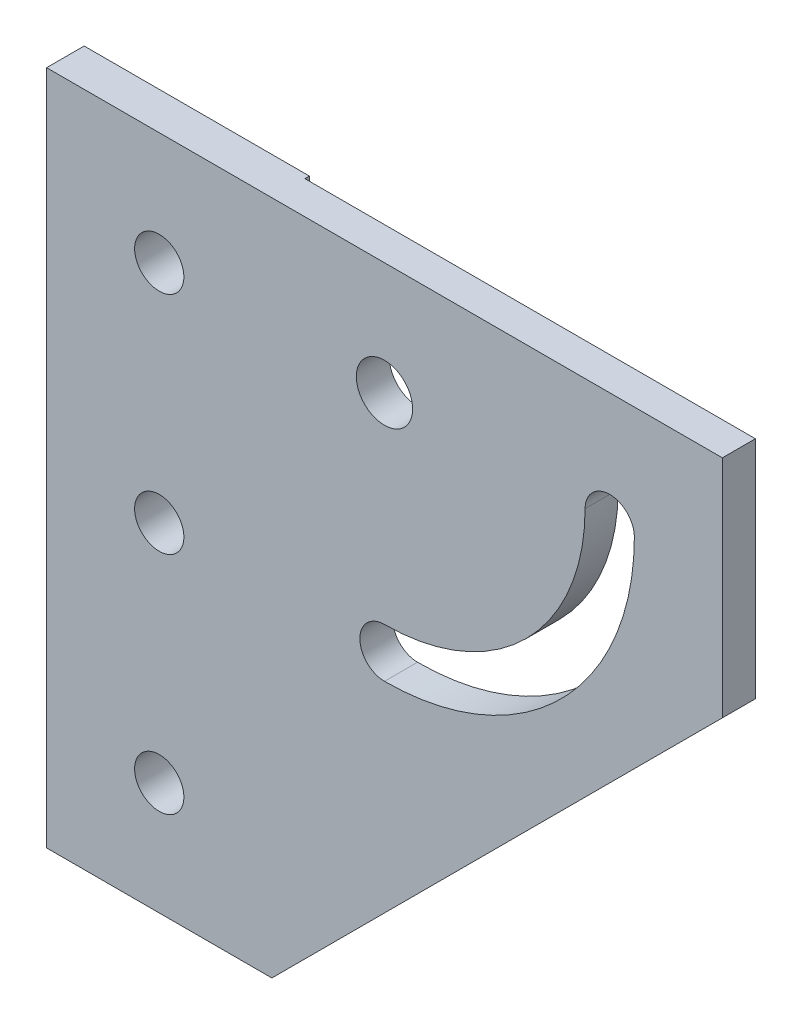
ISO-10303-21;
HEADER;
FILE_DESCRIPTION(('STEP AP214'),'2;1');
FILE_NAME('part.step','',(''),(''),'','','');
FILE_SCHEMA(('AUTOMOTIVE_DESIGN { 1 0 10303 214 1 1 1 1 }'));
ENDSEC;
DATA;
#1=APPLICATION_CONTEXT('core data for automotive mechanical design processes');
#2=APPLICATION_PROTOCOL_DEFINITION('international standard','automotive_design',2000,#1);
#3=PRODUCT_CONTEXT('',#1,'mechanical');
#4=PRODUCT('Part','Part','',(#3));
#5=PRODUCT_RELATED_PRODUCT_CATEGORY('part','',(#4));
#6=PRODUCT_DEFINITION_FORMATION('','',#4);
#7=PRODUCT_DEFINITION_CONTEXT('part definition',#1,'design');
#8=PRODUCT_DEFINITION('design','',#6,#7);
#9=PRODUCT_DEFINITION_SHAPE('','',#8);
#10=(LENGTH_UNIT() NAMED_UNIT(*) SI_UNIT(.MILLI.,.METRE.));
#11=(NAMED_UNIT(*) PLANE_ANGLE_UNIT() SI_UNIT($,.RADIAN.));
#12=(NAMED_UNIT(*) SI_UNIT($,.STERADIAN.) SOLID_ANGLE_UNIT());
#13=UNCERTAINTY_MEASURE_WITH_UNIT(LENGTH_MEASURE(1.E-05),#10,'distance_accuracy_value','');
#14=(GEOMETRIC_REPRESENTATION_CONTEXT(3) GLOBAL_UNCERTAINTY_ASSIGNED_CONTEXT((#13)) GLOBAL_UNIT_ASSIGNED_CONTEXT((#10,
#11,#12)) REPRESENTATION_CONTEXT('',''));
#15=CARTESIAN_POINT('',(0.,0.,0.));
#16=DIRECTION('',(0.,0.,1.));
#17=DIRECTION('',(1.,0.,0.));
#18=AXIS2_PLACEMENT_3D('',#15,#16,#17);
#19=CARTESIAN_POINT('',(-49.0731819323499,55.0077799028016,-5.98163409796489));
#20=DIRECTION('',(0.,0.,1.));
#21=DIRECTION('',(1.,0.,0.));
#22=AXIS2_PLACEMENT_3D('',#19,#20,#21);
#23=PLANE('',#22);
#24=CARTESIAN_POINT('',(-30.02318193235,-40.2422200971983,-5.98163409796489));
#25=DIRECTION('',(0.,0.,-1.));
#26=DIRECTION('',(-1.,0.,0.));
#27=AXIS2_PLACEMENT_3D('',#24,#25,#26);
#28=CIRCLE('',#27,4.16560000000001);
#29=CARTESIAN_POINT('',(-34.18878193235,-40.2422200971983,-5.98163409796489));
#30=VERTEX_POINT('',#29);
#31=EDGE_CURVE('E385',#30,#30,#28,.T.);
#32=ORIENTED_EDGE('',*,*,#31,.F.);
#33=EDGE_LOOP('',(#32));
#34=FACE_BOUND('',#33,.T.);
#35=CARTESIAN_POINT('',(-30.02318193235,35.9577799028017,-5.98163409796489));
#36=DIRECTION('',(0.,0.,-1.));
#37=DIRECTION('',(-1.,0.,0.));
#38=AXIS2_PLACEMENT_3D('',#35,#36,#37);
#39=CIRCLE('',#38,4.16560000000001);
#40=CARTESIAN_POINT('',(-34.18878193235,35.9577799028017,-5.98163409796489));
#41=VERTEX_POINT('',#40);
#42=EDGE_CURVE('E393',#41,#41,#39,.T.);
#43=ORIENTED_EDGE('',*,*,#42,.F.);
#44=EDGE_LOOP('',(#43));
#45=FACE_BOUND('',#44,.T.);
#46=DIRECTION('',(1.,0.,0.));
#47=VECTOR('',#46,1.);
#48=CARTESIAN_POINT('',(-10.97318193235,55.0077799028016,-5.98163409796489));
#49=LINE('',#48,#47);
#50=CARTESIAN_POINT('',(-49.0731819323499,55.0077799028016,-5.98163409796489));
#51=VERTEX_POINT('',#50);
#52=CARTESIAN_POINT('',(-10.97318193235,55.0077799028016,-5.98163409796489));
#53=VERTEX_POINT('',#52);
#54=EDGE_CURVE('E155',#51,#53,#49,.T.);
#55=ORIENTED_EDGE('',*,*,#54,.T.);
#56=DIRECTION('',(0.,-1.,0.));
#57=VECTOR('',#56,1.);
#58=CARTESIAN_POINT('',(-10.97318193235,-59.2922200971983,-5.98163409796489));
#59=LINE('',#58,#57);
#60=CARTESIAN_POINT('',(-10.97318193235,-59.2922200971983,-5.98163409796489));
#61=VERTEX_POINT('',#60);
#62=EDGE_CURVE('E158',#53,#61,#59,.T.);
#63=ORIENTED_EDGE('',*,*,#62,.T.);
#64=DIRECTION('',(-1.,0.,0.));
#65=VECTOR('',#64,1.);
#66=CARTESIAN_POINT('',(-49.0731819323499,-59.2922200971983,-5.98163409796489));
#67=LINE('',#66,#65);
#68=CARTESIAN_POINT('',(-49.0731819323499,-59.2922200971983,-5.98163409796489));
#69=VERTEX_POINT('',#68);
#70=EDGE_CURVE('E160',#61,#69,#67,.T.);
#71=ORIENTED_EDGE('',*,*,#70,.T.);
#72=DIRECTION('',(0.,1.,0.));
#73=VECTOR('',#72,1.);
#74=CARTESIAN_POINT('',(-49.0731819323499,55.0077799028016,-5.98163409796489));
#75=LINE('',#74,#73);
#76=EDGE_CURVE('E163',#69,#51,#75,.T.);
#77=ORIENTED_EDGE('',*,*,#76,.T.);
#78=EDGE_LOOP('',(#55,#63,#71,#77));
#79=FACE_BOUND('',#78,.T.);
#80=CARTESIAN_POINT('',(-30.02318193235,-2.14222009719833,-5.98163409796489));
#81=DIRECTION('',(0.,0.,-1.));
#82=DIRECTION('',(-1.,0.,0.));
#83=AXIS2_PLACEMENT_3D('',#80,#81,#82);
#84=CIRCLE('',#83,4.16560000000001);
#85=CARTESIAN_POINT('',(-34.18878193235,-2.14222009719833,-5.98163409796489));
#86=VERTEX_POINT('',#85);
#87=EDGE_CURVE('E398',#86,#86,#84,.T.);
#88=ORIENTED_EDGE('',*,*,#87,.F.);
#89=EDGE_LOOP('',(#88));
#90=FACE_BOUND('',#89,.T.);
#91=ADVANCED_FACE('F34',(#34,#45,#79,#90),#23,.F.);
#92=CARTESIAN_POINT('',(65.22681806765,55.0077799028016,-5.21963409796489));
#93=DIRECTION('',(0.,0.,1.));
#94=DIRECTION('',(1.,0.,0.));
#95=AXIS2_PLACEMENT_3D('',#92,#93,#94);
#96=PLANE('',#95);
#97=CARTESIAN_POINT('',(8.07681806765004,35.9577799028017,-5.21963409796489));
#98=DIRECTION('',(0.,0.,1.));
#99=DIRECTION('',(1.,0.,0.));
#100=AXIS2_PLACEMENT_3D('',#97,#98,#99);
#101=CIRCLE('',#100,4.76249999999999);
#102=CARTESIAN_POINT('',(12.83931806765,35.9577799028017,-5.21963409796489));
#103=VERTEX_POINT('',#102);
#104=EDGE_CURVE('E38',#103,#103,#101,.T.);
#105=ORIENTED_EDGE('',*,*,#104,.T.);
#106=EDGE_LOOP('',(#105));
#107=FACE_BOUND('',#106,.T.);
#108=CARTESIAN_POINT('',(46.17681806765,35.9577799028017,-5.21963409796489));
#109=DIRECTION('',(0.,0.,-1.));
#110=DIRECTION('',(-1.,0.,0.));
#111=AXIS2_PLACEMENT_3D('',#108,#109,#110);
#112=CIRCLE('',#111,4.16560000000002);
#113=CARTESIAN_POINT('',(42.01121806765,35.9577799028017,-5.21963409796489));
#114=VERTEX_POINT('',#113);
#115=CARTESIAN_POINT('',(50.34241806765,35.9577799028017,-5.21963409796489));
#116=VERTEX_POINT('',#115);
#117=EDGE_CURVE('E145',#114,#116,#112,.T.);
#118=ORIENTED_EDGE('',*,*,#117,.F.);
#119=CARTESIAN_POINT('',(8.07681806765004,35.9577799028017,-5.21963409796489));
#120=DIRECTION('',(0.,0.,1.));
#121=DIRECTION('',(1.,0.,0.));
#122=AXIS2_PLACEMENT_3D('',#119,#120,#121);
#123=CIRCLE('',#122,33.9344);
#124=CARTESIAN_POINT('',(8.07681806765004,2.02337990280166,-5.21963409796489));
#125=VERTEX_POINT('',#124);
#126=EDGE_CURVE('E51',#125,#114,#123,.T.);
#127=ORIENTED_EDGE('',*,*,#126,.F.);
#128=CARTESIAN_POINT('',(8.07681806765004,-2.14222009719833,-5.21963409796489));
#129=DIRECTION('',(0.,0.,-1.));
#130=DIRECTION('',(-1.,0.,0.));
#131=AXIS2_PLACEMENT_3D('',#128,#129,#130);
#132=CIRCLE('',#131,4.16559999999999);
#133=CARTESIAN_POINT('',(8.07681806765004,-6.30782009719834,-5.21963409796489));
#134=VERTEX_POINT('',#133);
#135=EDGE_CURVE('E133',#134,#125,#132,.T.);
#136=ORIENTED_EDGE('',*,*,#135,.F.);
#137=CARTESIAN_POINT('',(8.07681806765004,35.9577799028017,-5.21963409796489));
#138=DIRECTION('',(0.,0.,-1.));
#139=DIRECTION('',(-1.,0.,0.));
#140=AXIS2_PLACEMENT_3D('',#137,#138,#139);
#141=CIRCLE('',#140,42.2656);
#142=EDGE_CURVE('E136',#116,#134,#141,.T.);
#143=ORIENTED_EDGE('',*,*,#142,.F.);
#144=EDGE_LOOP('',(#118,#127,#136,#143));
#145=FACE_BOUND('',#144,.T.);
#146=DIRECTION('',(0.,-1.,0.));
#147=VECTOR('',#146,1.);
#148=CARTESIAN_POINT('',(-10.97318193235,-59.2922200971983,-5.21963409796489));
#149=LINE('',#148,#147);
#150=CARTESIAN_POINT('',(-10.97318193235,55.0077799028016,-5.21963409796489));
#151=VERTEX_POINT('',#150);
#152=CARTESIAN_POINT('',(-10.97318193235,-59.2922200971983,-5.21963409796489));
#153=VERTEX_POINT('',#152);
#154=EDGE_CURVE('E151',#151,#153,#149,.T.);
#155=ORIENTED_EDGE('',*,*,#154,.F.);
#156=DIRECTION('',(-1.,0.,0.));
#157=VECTOR('',#156,1.);
#158=CARTESIAN_POINT('',(65.22681806765,55.0077799028016,-5.21963409796489));
#159=LINE('',#158,#157);
#160=CARTESIAN_POINT('',(65.22681806765,55.0077799028016,-5.21963409796489));
#161=VERTEX_POINT('',#160);
#162=EDGE_CURVE('E174',#161,#151,#159,.T.);
#163=ORIENTED_EDGE('',*,*,#162,.F.);
#164=DIRECTION('',(0.,1.,0.));
#165=VECTOR('',#164,1.);
#166=CARTESIAN_POINT('',(65.22681806765,16.9077799028017,-5.21963409796489));
#167=LINE('',#166,#165);
#168=CARTESIAN_POINT('',(65.22681806765,16.9077799028017,-5.21963409796489));
#169=VERTEX_POINT('',#168);
#170=EDGE_CURVE('E171',#169,#161,#167,.T.);
#171=ORIENTED_EDGE('',*,*,#170,.F.);
#172=DIRECTION('',(0.707106781186548,0.707106781186548,0.));
#173=VECTOR('',#172,1.);
#174=CARTESIAN_POINT('',(-10.97318193235,-59.2922200971983,-5.21963409796489));
#175=LINE('',#174,#173);
#176=EDGE_CURVE('E178',#153,#169,#175,.T.);
#177=ORIENTED_EDGE('',*,*,#176,.F.);
#178=EDGE_LOOP('',(#155,#163,#171,#177));
#179=FACE_BOUND('',#178,.T.);
#180=ADVANCED_FACE('F225',(#107,#145,#179),#96,.F.);
#181=CARTESIAN_POINT('',(65.22681806765,16.9077799028017,-5.21963409796489));
#182=DIRECTION('',(1.,0.,0.));
#183=DIRECTION('',(0.,0.,-1.));
#184=AXIS2_PLACEMENT_3D('',#181,#182,#183);
#185=PLANE('',#184);
#186=DIRECTION('',(0.,1.,0.));
#187=VECTOR('',#186,1.);
#188=CARTESIAN_POINT('',(65.22681806765,16.9077799028017,0.368365902035111));
#189=LINE('',#188,#187);
#190=CARTESIAN_POINT('',(65.22681806765,16.9077799028017,0.368365902035111));
#191=VERTEX_POINT('',#190);
#192=CARTESIAN_POINT('',(65.22681806765,55.0077799028016,0.368365902035111));
#193=VERTEX_POINT('',#192);
#194=EDGE_CURVE('E191',#191,#193,#189,.T.);
#195=ORIENTED_EDGE('',*,*,#194,.F.);
#196=DIRECTION('',(0.,0.,1.));
#197=VECTOR('',#196,1.);
#198=CARTESIAN_POINT('',(65.22681806765,16.9077799028017,-5.21963409796489));
#199=LINE('',#198,#197);
#200=EDGE_CURVE('E11',#169,#191,#199,.T.);
#201=ORIENTED_EDGE('',*,*,#200,.F.);
#202=ORIENTED_EDGE('',*,*,#170,.T.);
#203=DIRECTION('',(0.,0.,1.));
#204=VECTOR('',#203,1.);
#205=CARTESIAN_POINT('',(65.22681806765,55.0077799028016,-5.21963409796489));
#206=LINE('',#205,#204);
#207=EDGE_CURVE('E184',#161,#193,#206,.T.);
#208=ORIENTED_EDGE('',*,*,#207,.T.);
#209=EDGE_LOOP('',(#195,#201,#202,#208));
#210=FACE_BOUND('',#209,.T.);
#211=ADVANCED_FACE('F36',(#210),#185,.T.);
#212=CARTESIAN_POINT('',(-10.97318193235,-59.2922200971983,-5.21963409796489));
#213=DIRECTION('',(0.707106781186548,-0.707106781186548,0.));
#214=DIRECTION('',(0.707106781186548,0.707106781186548,0.));
#215=AXIS2_PLACEMENT_3D('',#212,#213,#214);
#216=PLANE('',#215);
#217=DIRECTION('',(0.707106781186548,0.707106781186548,0.));
#218=VECTOR('',#217,1.);
#219=CARTESIAN_POINT('',(-10.97318193235,-59.2922200971983,0.368365902035111));
#220=LINE('',#219,#218);
#221=CARTESIAN_POINT('',(-10.97318193235,-59.2922200971983,0.368365902035111));
#222=VERTEX_POINT('',#221);
#223=EDGE_CURVE('E175',#222,#191,#220,.T.);
#224=ORIENTED_EDGE('',*,*,#223,.F.);
#225=DIRECTION('',(0.,0.,1.));
#226=VECTOR('',#225,1.);
#227=CARTESIAN_POINT('',(-10.97318193235,-59.2922200971983,-5.21963409796489));
#228=LINE('',#227,#226);
#229=EDGE_CURVE('E43',#153,#222,#228,.T.);
#230=ORIENTED_EDGE('',*,*,#229,.F.);
#231=ORIENTED_EDGE('',*,*,#176,.T.);
#232=ORIENTED_EDGE('',*,*,#200,.T.);
#233=EDGE_LOOP('',(#224,#230,#231,#232));
#234=FACE_BOUND('',#233,.T.);
#235=ADVANCED_FACE('F222',(#234),#216,.T.);
#236=CARTESIAN_POINT('',(-49.0731819323499,-59.2922200971983,-5.21963409796489));
#237=DIRECTION('',(0.,-1.,0.));
#238=DIRECTION('',(0.,0.,-1.));
#239=AXIS2_PLACEMENT_3D('',#236,#237,#238);
#240=PLANE('',#239);
#241=DIRECTION('',(1.,0.,0.));
#242=VECTOR('',#241,1.);
#243=CARTESIAN_POINT('',(-49.0731819323499,-59.2922200971983,0.368365902035111));
#244=LINE('',#243,#242);
#245=CARTESIAN_POINT('',(-49.0731819323499,-59.2922200971983,0.368365902035111));
#246=VERTEX_POINT('',#245);
#247=EDGE_CURVE('E206',#246,#222,#244,.T.);
#248=ORIENTED_EDGE('',*,*,#247,.F.);
#249=DIRECTION('',(0.,0.,1.));
#250=VECTOR('',#249,1.);
#251=CARTESIAN_POINT('',(-49.0731819323499,-59.2922200971983,-5.21963409796489));
#252=LINE('',#251,#250);
#253=EDGE_CURVE('E211',#69,#246,#252,.T.);
#254=ORIENTED_EDGE('',*,*,#253,.F.);
#255=ORIENTED_EDGE('',*,*,#70,.F.);
#256=DIRECTION('',(0.,0.,1.));
#257=VECTOR('',#256,1.);
#258=CARTESIAN_POINT('',(-10.97318193235,-59.2922200971983,-5.98163409796489));
#259=LINE('',#258,#257);
#260=EDGE_CURVE('E167',#61,#153,#259,.T.);
#261=ORIENTED_EDGE('',*,*,#260,.T.);
#262=ORIENTED_EDGE('',*,*,#229,.T.);
#263=EDGE_LOOP('',(#248,#254,#255,#261,#262));
#264=FACE_BOUND('',#263,.T.);
#265=ADVANCED_FACE('F229',(#264),#240,.T.);
#266=CARTESIAN_POINT('',(-49.0731819323499,55.0077799028016,-5.21963409796489));
#267=DIRECTION('',(-1.,0.,0.));
#268=DIRECTION('',(0.,0.,1.));
#269=AXIS2_PLACEMENT_3D('',#266,#267,#268);
#270=PLANE('',#269);
#271=DIRECTION('',(0.,-1.,0.));
#272=VECTOR('',#271,1.);
#273=CARTESIAN_POINT('',(-49.0731819323499,55.0077799028016,0.368365902035111));
#274=LINE('',#273,#272);
#275=CARTESIAN_POINT('',(-49.0731819323499,55.0077799028016,0.368365902035111));
#276=VERTEX_POINT('',#275);
#277=EDGE_CURVE('E200',#276,#246,#274,.T.);
#278=ORIENTED_EDGE('',*,*,#277,.F.);
#279=DIRECTION('',(0.,0.,1.));
#280=VECTOR('',#279,1.);
#281=CARTESIAN_POINT('',(-49.0731819323499,55.0077799028016,-5.21963409796489));
#282=LINE('',#281,#280);
#283=EDGE_CURVE('E212',#51,#276,#282,.T.);
#284=ORIENTED_EDGE('',*,*,#283,.F.);
#285=ORIENTED_EDGE('',*,*,#76,.F.);
#286=ORIENTED_EDGE('',*,*,#253,.T.);
#287=EDGE_LOOP('',(#278,#284,#285,#286));
#288=FACE_BOUND('',#287,.T.);
#289=ADVANCED_FACE('F238',(#288),#270,.T.);
#290=CARTESIAN_POINT('',(65.22681806765,55.0077799028016,-5.21963409796489));
#291=DIRECTION('',(0.,1.,0.));
#292=DIRECTION('',(0.,0.,1.));
#293=AXIS2_PLACEMENT_3D('',#290,#291,#292);
#294=PLANE('',#293);
#295=DIRECTION('',(-1.,0.,0.));
#296=VECTOR('',#295,1.);
#297=CARTESIAN_POINT('',(65.22681806765,55.0077799028016,0.368365902035111));
#298=LINE('',#297,#296);
#299=EDGE_CURVE('E196',#193,#276,#298,.T.);
#300=ORIENTED_EDGE('',*,*,#299,.F.);
#301=ORIENTED_EDGE('',*,*,#207,.F.);
#302=ORIENTED_EDGE('',*,*,#162,.T.);
#303=DIRECTION('',(0.,0.,1.));
#304=VECTOR('',#303,1.);
#305=CARTESIAN_POINT('',(-10.97318193235,55.0077799028016,-5.98163409796489));
#306=LINE('',#305,#304);
#307=EDGE_CURVE('E170',#53,#151,#306,.T.);
#308=ORIENTED_EDGE('',*,*,#307,.F.);
#309=ORIENTED_EDGE('',*,*,#54,.F.);
#310=ORIENTED_EDGE('',*,*,#283,.T.);
#311=EDGE_LOOP('',(#300,#301,#302,#308,#309,#310));
#312=FACE_BOUND('',#311,.T.);
#313=ADVANCED_FACE('F236',(#312),#294,.T.);
#314=CARTESIAN_POINT('',(65.22681806765,55.0077799028016,0.368365902035111));
#315=DIRECTION('',(0.,0.,1.));
#316=DIRECTION('',(1.,0.,0.));
#317=AXIS2_PLACEMENT_3D('',#314,#315,#316);
#318=PLANE('',#317);
#319=CARTESIAN_POINT('',(8.07681806765004,35.9577799028017,0.368365902035112));
#320=DIRECTION('',(0.,0.,1.));
#321=DIRECTION('',(1.,0.,0.));
#322=AXIS2_PLACEMENT_3D('',#319,#320,#321);
#323=CIRCLE('',#322,4.76249999999999);
#324=CARTESIAN_POINT('',(12.83931806765,35.9577799028017,0.368365902035112));
#325=VERTEX_POINT('',#324);
#326=EDGE_CURVE('E382',#325,#325,#323,.T.);
#327=ORIENTED_EDGE('',*,*,#326,.F.);
#328=EDGE_LOOP('',(#327));
#329=FACE_BOUND('',#328,.T.);
#330=CARTESIAN_POINT('',(-30.02318193235,-40.2422200971983,0.368365902035105));
#331=DIRECTION('',(0.,0.,-1.));
#332=DIRECTION('',(-1.,0.,0.));
#333=AXIS2_PLACEMENT_3D('',#330,#331,#332);
#334=CIRCLE('',#333,4.16560000000001);
#335=CARTESIAN_POINT('',(-34.18878193235,-40.2422200971983,0.368365902035105));
#336=VERTEX_POINT('',#335);
#337=EDGE_CURVE('E387',#336,#336,#334,.T.);
#338=ORIENTED_EDGE('',*,*,#337,.T.);
#339=EDGE_LOOP('',(#338));
#340=FACE_BOUND('',#339,.T.);
#341=CARTESIAN_POINT('',(-30.02318193235,35.9577799028017,0.368365902035105));
#342=DIRECTION('',(0.,0.,-1.));
#343=DIRECTION('',(-1.,0.,0.));
#344=AXIS2_PLACEMENT_3D('',#341,#342,#343);
#345=CIRCLE('',#344,4.16560000000001);
#346=CARTESIAN_POINT('',(-34.18878193235,35.9577799028017,0.368365902035105));
#347=VERTEX_POINT('',#346);
#348=EDGE_CURVE('E396',#347,#347,#345,.T.);
#349=ORIENTED_EDGE('',*,*,#348,.T.);
#350=EDGE_LOOP('',(#349));
#351=FACE_BOUND('',#350,.T.);
#352=CARTESIAN_POINT('',(-30.02318193235,-2.14222009719833,0.368365902035105));
#353=DIRECTION('',(0.,0.,-1.));
#354=DIRECTION('',(-1.,0.,0.));
#355=AXIS2_PLACEMENT_3D('',#352,#353,#354);
#356=CIRCLE('',#355,4.16560000000001);
#357=CARTESIAN_POINT('',(-34.18878193235,-2.14222009719833,0.368365902035105));
#358=VERTEX_POINT('',#357);
#359=EDGE_CURVE('E139',#358,#358,#356,.T.);
#360=ORIENTED_EDGE('',*,*,#359,.T.);
#361=EDGE_LOOP('',(#360));
#362=FACE_BOUND('',#361,.T.);
#363=CARTESIAN_POINT('',(8.07681806765004,35.9577799028017,0.368365902035111));
#364=DIRECTION('',(0.,0.,1.));
#365=DIRECTION('',(1.,0.,0.));
#366=AXIS2_PLACEMENT_3D('',#363,#364,#365);
#367=CIRCLE('',#366,33.9344);
#368=CARTESIAN_POINT('',(8.07681806765004,2.02337990280166,0.368365902035111));
#369=VERTEX_POINT('',#368);
#370=CARTESIAN_POINT('',(42.01121806765,35.9577799028017,0.368365902035111));
#371=VERTEX_POINT('',#370);
#372=EDGE_CURVE('E117',#369,#371,#367,.T.);
#373=ORIENTED_EDGE('',*,*,#372,.T.);
#374=CARTESIAN_POINT('',(46.17681806765,35.9577799028017,0.368365902035111));
#375=DIRECTION('',(0.,0.,-1.));
#376=DIRECTION('',(-1.,0.,0.));
#377=AXIS2_PLACEMENT_3D('',#374,#375,#376);
#378=CIRCLE('',#377,4.16560000000002);
#379=CARTESIAN_POINT('',(50.34241806765,35.9577799028017,0.368365902035111));
#380=VERTEX_POINT('',#379);
#381=EDGE_CURVE('E126',#371,#380,#378,.T.);
#382=ORIENTED_EDGE('',*,*,#381,.T.);
#383=CARTESIAN_POINT('',(8.07681806765004,35.9577799028017,0.368365902035111));
#384=DIRECTION('',(0.,0.,-1.));
#385=DIRECTION('',(-1.,0.,0.));
#386=AXIS2_PLACEMENT_3D('',#383,#384,#385);
#387=CIRCLE('',#386,42.2656);
#388=CARTESIAN_POINT('',(8.07681806765004,-6.30782009719834,0.368365902035111));
#389=VERTEX_POINT('',#388);
#390=EDGE_CURVE('E59',#380,#389,#387,.T.);
#391=ORIENTED_EDGE('',*,*,#390,.T.);
#392=CARTESIAN_POINT('',(8.07681806765004,-2.14222009719833,0.368365902035111));
#393=DIRECTION('',(0.,0.,-1.));
#394=DIRECTION('',(-1.,0.,0.));
#395=AXIS2_PLACEMENT_3D('',#392,#393,#394);
#396=CIRCLE('',#395,4.16559999999999);
#397=EDGE_CURVE('E123',#389,#369,#396,.T.);
#398=ORIENTED_EDGE('',*,*,#397,.T.);
#399=EDGE_LOOP('',(#373,#382,#391,#398));
#400=FACE_BOUND('',#399,.T.);
#401=ORIENTED_EDGE('',*,*,#194,.T.);
#402=ORIENTED_EDGE('',*,*,#299,.T.);
#403=ORIENTED_EDGE('',*,*,#277,.T.);
#404=ORIENTED_EDGE('',*,*,#247,.T.);
#405=ORIENTED_EDGE('',*,*,#223,.T.);
#406=EDGE_LOOP('',(#401,#402,#403,#404,#405));
#407=FACE_BOUND('',#406,.T.);
#408=ADVANCED_FACE('F130',(#329,#340,#351,#362,#400,#407),#318,.T.);
#409=CARTESIAN_POINT('',(-10.97318193235,-59.2922200971983,-5.98163409796489));
#410=DIRECTION('',(-1.,0.,0.));
#411=DIRECTION('',(0.,0.,1.));
#412=AXIS2_PLACEMENT_3D('',#409,#410,#411);
#413=PLANE('',#412);
#414=ORIENTED_EDGE('',*,*,#154,.T.);
#415=ORIENTED_EDGE('',*,*,#260,.F.);
#416=ORIENTED_EDGE('',*,*,#62,.F.);
#417=ORIENTED_EDGE('',*,*,#307,.T.);
#418=EDGE_LOOP('',(#414,#415,#416,#417));
#419=FACE_BOUND('',#418,.T.);
#420=ADVANCED_FACE('F232',(#419),#413,.F.);
#421=CARTESIAN_POINT('',(8.07681806765004,35.9577799028017,0.368365902035111));
#422=DIRECTION('',(0.,0.,-1.));
#423=DIRECTION('',(-1.,0.,0.));
#424=AXIS2_PLACEMENT_3D('',#421,#422,#423);
#425=CYLINDRICAL_SURFACE('',#424,33.9344);
#426=ORIENTED_EDGE('',*,*,#126,.T.);
#427=DIRECTION('',(0.,0.,-1.));
#428=VECTOR('',#427,1.);
#429=CARTESIAN_POINT('',(42.01121806765,35.9577799028017,0.368365902035111));
#430=LINE('',#429,#428);
#431=EDGE_CURVE('E113',#371,#114,#430,.T.);
#432=ORIENTED_EDGE('',*,*,#431,.F.);
#433=ORIENTED_EDGE('',*,*,#372,.F.);
#434=DIRECTION('',(0.,0.,-1.));
#435=VECTOR('',#434,1.);
#436=CARTESIAN_POINT('',(8.07681806765004,2.02337990280166,0.368365902035111));
#437=LINE('',#436,#435);
#438=EDGE_CURVE('E149',#369,#125,#437,.T.);
#439=ORIENTED_EDGE('',*,*,#438,.T.);
#440=EDGE_LOOP('',(#426,#432,#433,#439));
#441=FACE_BOUND('',#440,.T.);
#442=ADVANCED_FACE('F115',(#441),#425,.T.);
#443=CARTESIAN_POINT('',(8.07681806765004,-2.14222009719833,0.368365902035111));
#444=DIRECTION('',(0.,0.,-1.));
#445=DIRECTION('',(-1.,0.,0.));
#446=AXIS2_PLACEMENT_3D('',#443,#444,#445);
#447=CYLINDRICAL_SURFACE('',#446,4.16559999999999);
#448=ORIENTED_EDGE('',*,*,#135,.T.);
#449=ORIENTED_EDGE('',*,*,#438,.F.);
#450=ORIENTED_EDGE('',*,*,#397,.F.);
#451=DIRECTION('',(0.,0.,-1.));
#452=VECTOR('',#451,1.);
#453=CARTESIAN_POINT('',(8.07681806765004,-6.30782009719834,0.368365902035111));
#454=LINE('',#453,#452);
#455=EDGE_CURVE('E152',#389,#134,#454,.T.);
#456=ORIENTED_EDGE('',*,*,#455,.T.);
#457=EDGE_LOOP('',(#448,#449,#450,#456));
#458=FACE_BOUND('',#457,.T.);
#459=ADVANCED_FACE('F295',(#458),#447,.F.);
#460=CARTESIAN_POINT('',(8.07681806765004,35.9577799028017,0.368365902035111));
#461=DIRECTION('',(0.,0.,-1.));
#462=DIRECTION('',(-1.,0.,0.));
#463=AXIS2_PLACEMENT_3D('',#460,#461,#462);
#464=CYLINDRICAL_SURFACE('',#463,42.2656);
#465=ORIENTED_EDGE('',*,*,#142,.T.);
#466=ORIENTED_EDGE('',*,*,#455,.F.);
#467=ORIENTED_EDGE('',*,*,#390,.F.);
#468=DIRECTION('',(0.,0.,-1.));
#469=VECTOR('',#468,1.);
#470=CARTESIAN_POINT('',(50.34241806765,35.9577799028017,0.368365902035111));
#471=LINE('',#470,#469);
#472=EDGE_CURVE('E122',#380,#116,#471,.T.);
#473=ORIENTED_EDGE('',*,*,#472,.T.);
#474=EDGE_LOOP('',(#465,#466,#467,#473));
#475=FACE_BOUND('',#474,.T.);
#476=ADVANCED_FACE('F303',(#475),#464,.F.);
#477=CARTESIAN_POINT('',(46.17681806765,35.9577799028017,0.368365902035111));
#478=DIRECTION('',(0.,0.,-1.));
#479=DIRECTION('',(-1.,0.,0.));
#480=AXIS2_PLACEMENT_3D('',#477,#478,#479);
#481=CYLINDRICAL_SURFACE('',#480,4.16560000000002);
#482=ORIENTED_EDGE('',*,*,#117,.T.);
#483=ORIENTED_EDGE('',*,*,#472,.F.);
#484=ORIENTED_EDGE('',*,*,#381,.F.);
#485=ORIENTED_EDGE('',*,*,#431,.T.);
#486=EDGE_LOOP('',(#482,#483,#484,#485));
#487=FACE_BOUND('',#486,.T.);
#488=ADVANCED_FACE('F127',(#487),#481,.F.);
#489=CARTESIAN_POINT('',(-30.02318193235,-2.14222009719833,-5.98163409796489));
#490=DIRECTION('',(0.,0.,-1.));
#491=DIRECTION('',(-1.,0.,0.));
#492=AXIS2_PLACEMENT_3D('',#489,#490,#491);
#493=CYLINDRICAL_SURFACE('',#492,4.16560000000001);
#494=ORIENTED_EDGE('',*,*,#359,.F.);
#495=EDGE_LOOP('',(#494));
#496=FACE_BOUND('',#495,.T.);
#497=ORIENTED_EDGE('',*,*,#87,.T.);
#498=EDGE_LOOP('',(#497));
#499=FACE_BOUND('',#498,.T.);
#500=ADVANCED_FACE('F321',(#496,#499),#493,.F.);
#501=CARTESIAN_POINT('',(-30.02318193235,35.9577799028017,-5.98163409796489));
#502=DIRECTION('',(0.,0.,-1.));
#503=DIRECTION('',(-1.,0.,0.));
#504=AXIS2_PLACEMENT_3D('',#501,#502,#503);
#505=CYLINDRICAL_SURFACE('',#504,4.16560000000001);
#506=ORIENTED_EDGE('',*,*,#348,.F.);
#507=EDGE_LOOP('',(#506));
#508=FACE_BOUND('',#507,.T.);
#509=ORIENTED_EDGE('',*,*,#42,.T.);
#510=EDGE_LOOP('',(#509));
#511=FACE_BOUND('',#510,.T.);
#512=ADVANCED_FACE('F330',(#508,#511),#505,.F.);
#513=CARTESIAN_POINT('',(-30.02318193235,-40.2422200971983,-5.98163409796489));
#514=DIRECTION('',(0.,0.,-1.));
#515=DIRECTION('',(-1.,0.,0.));
#516=AXIS2_PLACEMENT_3D('',#513,#514,#515);
#517=CYLINDRICAL_SURFACE('',#516,4.16560000000001);
#518=ORIENTED_EDGE('',*,*,#337,.F.);
#519=EDGE_LOOP('',(#518));
#520=FACE_BOUND('',#519,.T.);
#521=ORIENTED_EDGE('',*,*,#31,.T.);
#522=EDGE_LOOP('',(#521));
#523=FACE_BOUND('',#522,.T.);
#524=ADVANCED_FACE('F339',(#520,#523),#517,.F.);
#525=CARTESIAN_POINT('',(8.07681806765004,35.9577799028017,0.368365902035111));
#526=DIRECTION('',(0.,0.,1.));
#527=DIRECTION('',(1.,0.,0.));
#528=AXIS2_PLACEMENT_3D('',#525,#526,#527);
#529=CYLINDRICAL_SURFACE('',#528,4.76249999999999);
#530=ORIENTED_EDGE('',*,*,#326,.T.);
#531=EDGE_LOOP('',(#530));
#532=FACE_BOUND('',#531,.T.);
#533=ORIENTED_EDGE('',*,*,#104,.F.);
#534=EDGE_LOOP('',(#533));
#535=FACE_BOUND('',#534,.T.);
#536=ADVANCED_FACE('F353',(#532,#535),#529,.F.);
#537=CLOSED_SHELL('',(#91,#180,#211,#235,#265,#289,#313,#408,#420,#442,#459,#476,#488,#500,#512,
#524,#536));
#538=MANIFOLD_SOLID_BREP('B2',#537);
#539=ADVANCED_BREP_SHAPE_REPRESENTATION('',(#18,#538),#14);
#540=SHAPE_DEFINITION_REPRESENTATION(#9,#539);
ENDSEC;
END-ISO-10303-21;
